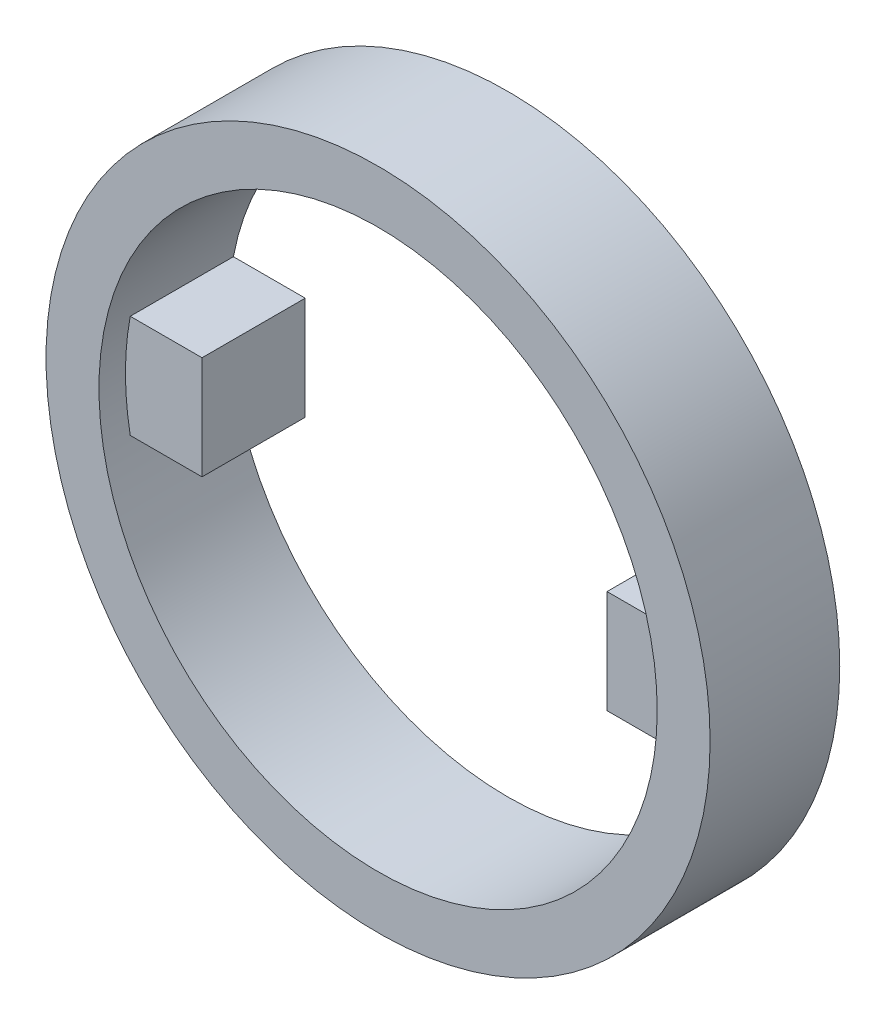
ISO-10303-21;
HEADER;
FILE_DESCRIPTION(('STEP AP214'),'2;1');
FILE_NAME('part.step','',(''),(''),'','','');
FILE_SCHEMA(('AUTOMOTIVE_DESIGN { 1 0 10303 214 1 1 1 1 }'));
ENDSEC;
DATA;
#1=APPLICATION_CONTEXT('core data for automotive mechanical design processes');
#2=APPLICATION_PROTOCOL_DEFINITION('international standard','automotive_design',2000,#1);
#3=PRODUCT_CONTEXT('',#1,'mechanical');
#4=PRODUCT('Part','Part','',(#3));
#5=PRODUCT_RELATED_PRODUCT_CATEGORY('part','',(#4));
#6=PRODUCT_DEFINITION_FORMATION('','',#4);
#7=PRODUCT_DEFINITION_CONTEXT('part definition',#1,'design');
#8=PRODUCT_DEFINITION('design','',#6,#7);
#9=PRODUCT_DEFINITION_SHAPE('','',#8);
#10=(LENGTH_UNIT() NAMED_UNIT(*) SI_UNIT(.MILLI.,.METRE.));
#11=(NAMED_UNIT(*) PLANE_ANGLE_UNIT() SI_UNIT($,.RADIAN.));
#12=(NAMED_UNIT(*) SI_UNIT($,.STERADIAN.) SOLID_ANGLE_UNIT());
#13=UNCERTAINTY_MEASURE_WITH_UNIT(LENGTH_MEASURE(1.E-05),#10,'distance_accuracy_value','');
#14=(GEOMETRIC_REPRESENTATION_CONTEXT(3) GLOBAL_UNCERTAINTY_ASSIGNED_CONTEXT((#13)) GLOBAL_UNIT_ASSIGNED_CONTEXT((#10,
#11,#12)) REPRESENTATION_CONTEXT('',''));
#15=CARTESIAN_POINT('',(0.,0.,0.));
#16=DIRECTION('',(0.,0.,1.));
#17=DIRECTION('',(1.,0.,0.));
#18=AXIS2_PLACEMENT_3D('',#15,#16,#17);
#19=CARTESIAN_POINT('',(0.,0.,4.9));
#20=DIRECTION('',(0.,0.,-1.));
#21=DIRECTION('',(-1.,0.,0.));
#22=AXIS2_PLACEMENT_3D('',#19,#20,#21);
#23=CYLINDRICAL_SURFACE('',#22,10.55);
#24=CARTESIAN_POINT('',(0.,0.,4.9));
#25=DIRECTION('',(0.,0.,1.));
#26=DIRECTION('',(1.,0.,0.));
#27=AXIS2_PLACEMENT_3D('',#24,#25,#26);
#28=CIRCLE('',#27,10.55);
#29=CARTESIAN_POINT('',(10.55,0.,4.9));
#30=VERTEX_POINT('',#29);
#31=EDGE_CURVE('E169',#30,#30,#28,.T.);
#32=ORIENTED_EDGE('',*,*,#31,.T.);
#33=EDGE_LOOP('',(#32));
#34=FACE_BOUND('',#33,.T.);
#35=CARTESIAN_POINT('',(0.,0.,0.));
#36=DIRECTION('',(0.,0.,1.));
#37=DIRECTION('',(1.,0.,0.));
#38=AXIS2_PLACEMENT_3D('',#35,#36,#37);
#39=CIRCLE('',#38,10.55);
#40=CARTESIAN_POINT('',(10.3682206766639,1.95,0.));
#41=VERTEX_POINT('',#40);
#42=CARTESIAN_POINT('',(-10.3682206766639,1.95,0.));
#43=VERTEX_POINT('',#42);
#44=EDGE_CURVE('E168',#41,#43,#39,.T.);
#45=ORIENTED_EDGE('',*,*,#44,.F.);
#46=DIRECTION('',(0.,0.,-1.));
#47=VECTOR('',#46,1.);
#48=CARTESIAN_POINT('',(10.3682206766639,1.95,4.9));
#49=LINE('',#48,#47);
#50=CARTESIAN_POINT('',(10.3682206766639,1.95,3.9));
#51=VERTEX_POINT('',#50);
#52=EDGE_CURVE('E144',#41,#51,#49,.F.);
#53=ORIENTED_EDGE('',*,*,#52,.T.);
#54=CARTESIAN_POINT('',(0.,0.,3.9));
#55=DIRECTION('',(0.,0.,-1.));
#56=DIRECTION('',(-1.,0.,0.));
#57=AXIS2_PLACEMENT_3D('',#54,#55,#56);
#58=CIRCLE('',#57,10.55);
#59=CARTESIAN_POINT('',(10.3682206766639,-1.95,3.9));
#60=VERTEX_POINT('',#59);
#61=EDGE_CURVE('E12',#51,#60,#58,.T.);
#62=ORIENTED_EDGE('',*,*,#61,.T.);
#63=DIRECTION('',(0.,0.,-1.));
#64=VECTOR('',#63,1.);
#65=CARTESIAN_POINT('',(10.3682206766639,-1.95,4.9));
#66=LINE('',#65,#64);
#67=CARTESIAN_POINT('',(10.3682206766639,-1.95,0.));
#68=VERTEX_POINT('',#67);
#69=EDGE_CURVE('E140',#60,#68,#66,.T.);
#70=ORIENTED_EDGE('',*,*,#69,.T.);
#71=CARTESIAN_POINT('',(-10.3682206766639,-1.95,0.));
#72=VERTEX_POINT('',#71);
#73=EDGE_CURVE('E132',#72,#68,#39,.T.);
#74=ORIENTED_EDGE('',*,*,#73,.F.);
#75=DIRECTION('',(0.,0.,-1.));
#76=VECTOR('',#75,1.);
#77=CARTESIAN_POINT('',(-10.3682206766639,-1.95,4.9));
#78=LINE('',#77,#76);
#79=CARTESIAN_POINT('',(-10.3682206766639,-1.95,3.9));
#80=VERTEX_POINT('',#79);
#81=EDGE_CURVE('E181',#72,#80,#78,.F.);
#82=ORIENTED_EDGE('',*,*,#81,.T.);
#83=CARTESIAN_POINT('',(0.,0.,3.9));
#84=DIRECTION('',(0.,0.,1.));
#85=DIRECTION('',(1.,0.,0.));
#86=AXIS2_PLACEMENT_3D('',#83,#84,#85);
#87=CIRCLE('',#86,10.55);
#88=CARTESIAN_POINT('',(-10.3682206766639,1.95,3.9));
#89=VERTEX_POINT('',#88);
#90=EDGE_CURVE('E177',#89,#80,#87,.T.);
#91=ORIENTED_EDGE('',*,*,#90,.F.);
#92=DIRECTION('',(0.,0.,-1.));
#93=VECTOR('',#92,1.);
#94=CARTESIAN_POINT('',(-10.3682206766639,1.95,4.9));
#95=LINE('',#94,#93);
#96=EDGE_CURVE('E55',#89,#43,#95,.T.);
#97=ORIENTED_EDGE('',*,*,#96,.T.);
#98=EDGE_LOOP('',(#45,#53,#62,#70,#74,#82,#91,#97));
#99=FACE_BOUND('',#98,.T.);
#100=ADVANCED_FACE('F47',(#34,#99),#23,.F.);
#101=CARTESIAN_POINT('',(0.,0.,4.9));
#102=DIRECTION('',(0.,0.,1.));
#103=DIRECTION('',(1.,0.,0.));
#104=AXIS2_PLACEMENT_3D('',#101,#102,#103);
#105=PLANE('',#104);
#106=CARTESIAN_POINT('',(0.,0.,4.9));
#107=DIRECTION('',(0.,0.,1.));
#108=DIRECTION('',(1.,0.,0.));
#109=AXIS2_PLACEMENT_3D('',#106,#107,#108);
#110=CIRCLE('',#109,12.55);
#111=CARTESIAN_POINT('',(12.55,0.,4.9));
#112=VERTEX_POINT('',#111);
#113=EDGE_CURVE('E174',#112,#112,#110,.T.);
#114=ORIENTED_EDGE('',*,*,#113,.T.);
#115=EDGE_LOOP('',(#114));
#116=FACE_BOUND('',#115,.T.);
#117=ORIENTED_EDGE('',*,*,#31,.F.);
#118=EDGE_LOOP('',(#117));
#119=FACE_BOUND('',#118,.T.);
#120=ADVANCED_FACE('F213',(#116,#119),#105,.T.);
#121=CARTESIAN_POINT('',(0.,0.,0.));
#122=DIRECTION('',(0.,0.,1.));
#123=DIRECTION('',(1.,0.,0.));
#124=AXIS2_PLACEMENT_3D('',#121,#122,#123);
#125=PLANE('',#124);
#126=ORIENTED_EDGE('',*,*,#73,.T.);
#127=DIRECTION('',(1.,0.,0.));
#128=VECTOR('',#127,1.);
#129=CARTESIAN_POINT('',(11.209871346078,-1.95,0.));
#130=LINE('',#129,#128);
#131=CARTESIAN_POINT('',(7.65419850849141,-1.95,0.));
#132=VERTEX_POINT('',#131);
#133=EDGE_CURVE('E121',#132,#68,#130,.T.);
#134=ORIENTED_EDGE('',*,*,#133,.F.);
#135=DIRECTION('',(0.,-1.,0.));
#136=VECTOR('',#135,1.);
#137=CARTESIAN_POINT('',(7.65419850849141,1.95,0.));
#138=LINE('',#137,#136);
#139=CARTESIAN_POINT('',(7.65419850849141,1.95,0.));
#140=VERTEX_POINT('',#139);
#141=EDGE_CURVE('E112',#140,#132,#138,.T.);
#142=ORIENTED_EDGE('',*,*,#141,.F.);
#143=DIRECTION('',(-1.,0.,0.));
#144=VECTOR('',#143,1.);
#145=CARTESIAN_POINT('',(11.209871346078,1.95,0.));
#146=LINE('',#145,#144);
#147=EDGE_CURVE('E62',#41,#140,#146,.T.);
#148=ORIENTED_EDGE('',*,*,#147,.F.);
#149=ORIENTED_EDGE('',*,*,#44,.T.);
#150=DIRECTION('',(-1.,0.,0.));
#151=VECTOR('',#150,1.);
#152=CARTESIAN_POINT('',(-11.209871346078,1.95,0.));
#153=LINE('',#152,#151);
#154=CARTESIAN_POINT('',(-7.65419850849141,1.95,0.));
#155=VERTEX_POINT('',#154);
#156=EDGE_CURVE('E159',#155,#43,#153,.T.);
#157=ORIENTED_EDGE('',*,*,#156,.F.);
#158=DIRECTION('',(0.,1.,0.));
#159=VECTOR('',#158,1.);
#160=CARTESIAN_POINT('',(-7.65419850849141,1.95,0.));
#161=LINE('',#160,#159);
#162=CARTESIAN_POINT('',(-7.65419850849141,-1.95,0.));
#163=VERTEX_POINT('',#162);
#164=EDGE_CURVE('E147',#163,#155,#161,.T.);
#165=ORIENTED_EDGE('',*,*,#164,.F.);
#166=DIRECTION('',(1.,0.,0.));
#167=VECTOR('',#166,1.);
#168=CARTESIAN_POINT('',(-11.209871346078,-1.95,0.));
#169=LINE('',#168,#167);
#170=EDGE_CURVE('E69',#72,#163,#169,.T.);
#171=ORIENTED_EDGE('',*,*,#170,.F.);
#172=EDGE_LOOP('',(#126,#134,#142,#148,#149,#157,#165,#171));
#173=FACE_BOUND('',#172,.T.);
#174=CARTESIAN_POINT('',(0.,0.,0.));
#175=DIRECTION('',(0.,0.,1.));
#176=DIRECTION('',(1.,0.,0.));
#177=AXIS2_PLACEMENT_3D('',#174,#175,#176);
#178=CIRCLE('',#177,12.55);
#179=CARTESIAN_POINT('',(12.55,0.,0.));
#180=VERTEX_POINT('',#179);
#181=EDGE_CURVE('E172',#180,#180,#178,.T.);
#182=ORIENTED_EDGE('',*,*,#181,.F.);
#183=EDGE_LOOP('',(#182));
#184=FACE_BOUND('',#183,.T.);
#185=ADVANCED_FACE('F129',(#173,#184),#125,.F.);
#186=CARTESIAN_POINT('',(0.,0.,4.9));
#187=DIRECTION('',(0.,0.,-1.));
#188=DIRECTION('',(-1.,0.,0.));
#189=AXIS2_PLACEMENT_3D('',#186,#187,#188);
#190=CYLINDRICAL_SURFACE('',#189,12.55);
#191=ORIENTED_EDGE('',*,*,#113,.F.);
#192=EDGE_LOOP('',(#191));
#193=FACE_BOUND('',#192,.T.);
#194=ORIENTED_EDGE('',*,*,#181,.T.);
#195=EDGE_LOOP('',(#194));
#196=FACE_BOUND('',#195,.T.);
#197=ADVANCED_FACE('F49',(#193,#196),#190,.T.);
#198=CARTESIAN_POINT('',(0.,0.,3.9));
#199=DIRECTION('',(0.,0.,1.));
#200=DIRECTION('',(1.,0.,0.));
#201=AXIS2_PLACEMENT_3D('',#198,#199,#200);
#202=PLANE('',#201);
#203=DIRECTION('',(-1.,0.,0.));
#204=VECTOR('',#203,1.);
#205=CARTESIAN_POINT('',(-11.209871346078,1.95,3.9));
#206=LINE('',#205,#204);
#207=CARTESIAN_POINT('',(-7.65419850849141,1.95,3.9));
#208=VERTEX_POINT('',#207);
#209=EDGE_CURVE('E151',#208,#89,#206,.T.);
#210=ORIENTED_EDGE('',*,*,#209,.T.);
#211=ORIENTED_EDGE('',*,*,#90,.T.);
#212=DIRECTION('',(1.,0.,0.));
#213=VECTOR('',#212,1.);
#214=CARTESIAN_POINT('',(-11.209871346078,-1.95,3.9));
#215=LINE('',#214,#213);
#216=CARTESIAN_POINT('',(-7.65419850849141,-1.95,3.9));
#217=VERTEX_POINT('',#216);
#218=EDGE_CURVE('E154',#80,#217,#215,.T.);
#219=ORIENTED_EDGE('',*,*,#218,.T.);
#220=DIRECTION('',(0.,1.,0.));
#221=VECTOR('',#220,1.);
#222=CARTESIAN_POINT('',(-7.65419850849141,1.95,3.9));
#223=LINE('',#222,#221);
#224=EDGE_CURVE('E148',#217,#208,#223,.T.);
#225=ORIENTED_EDGE('',*,*,#224,.T.);
#226=EDGE_LOOP('',(#210,#211,#219,#225));
#227=FACE_BOUND('',#226,.T.);
#228=ADVANCED_FACE('F190',(#227),#202,.T.);
#229=CARTESIAN_POINT('',(-7.65419850849141,1.95,3.9));
#230=DIRECTION('',(-1.,0.,0.));
#231=DIRECTION('',(0.,0.,1.));
#232=AXIS2_PLACEMENT_3D('',#229,#230,#231);
#233=PLANE('',#232);
#234=ORIENTED_EDGE('',*,*,#164,.T.);
#235=DIRECTION('',(0.,0.,-1.));
#236=VECTOR('',#235,1.);
#237=CARTESIAN_POINT('',(-7.65419850849141,1.95,3.9));
#238=LINE('',#237,#236);
#239=EDGE_CURVE('E165',#208,#155,#238,.T.);
#240=ORIENTED_EDGE('',*,*,#239,.F.);
#241=ORIENTED_EDGE('',*,*,#224,.F.);
#242=DIRECTION('',(0.,0.,-1.));
#243=VECTOR('',#242,1.);
#244=CARTESIAN_POINT('',(-7.65419850849141,-1.95,3.9));
#245=LINE('',#244,#243);
#246=EDGE_CURVE('E156',#217,#163,#245,.T.);
#247=ORIENTED_EDGE('',*,*,#246,.T.);
#248=EDGE_LOOP('',(#234,#240,#241,#247));
#249=FACE_BOUND('',#248,.T.);
#250=ADVANCED_FACE('F196',(#249),#233,.F.);
#251=CARTESIAN_POINT('',(-11.209871346078,1.95,3.9));
#252=DIRECTION('',(0.,-1.,0.));
#253=DIRECTION('',(0.,0.,-1.));
#254=AXIS2_PLACEMENT_3D('',#251,#252,#253);
#255=PLANE('',#254);
#256=ORIENTED_EDGE('',*,*,#96,.F.);
#257=ORIENTED_EDGE('',*,*,#209,.F.);
#258=ORIENTED_EDGE('',*,*,#239,.T.);
#259=ORIENTED_EDGE('',*,*,#156,.T.);
#260=EDGE_LOOP('',(#256,#257,#258,#259));
#261=FACE_BOUND('',#260,.T.);
#262=ADVANCED_FACE('F188',(#261),#255,.F.);
#263=CARTESIAN_POINT('',(-11.209871346078,-1.95,3.9));
#264=DIRECTION('',(0.,1.,0.));
#265=DIRECTION('',(0.,0.,1.));
#266=AXIS2_PLACEMENT_3D('',#263,#264,#265);
#267=PLANE('',#266);
#268=ORIENTED_EDGE('',*,*,#81,.F.);
#269=ORIENTED_EDGE('',*,*,#170,.T.);
#270=ORIENTED_EDGE('',*,*,#246,.F.);
#271=ORIENTED_EDGE('',*,*,#218,.F.);
#272=EDGE_LOOP('',(#268,#269,#270,#271));
#273=FACE_BOUND('',#272,.T.);
#274=ADVANCED_FACE('F198',(#273),#267,.F.);
#275=CARTESIAN_POINT('',(0.,0.,3.9));
#276=DIRECTION('',(0.,0.,-1.));
#277=DIRECTION('',(-1.,0.,0.));
#278=AXIS2_PLACEMENT_3D('',#275,#276,#277);
#279=PLANE('',#278);
#280=ORIENTED_EDGE('',*,*,#61,.F.);
#281=DIRECTION('',(-1.,0.,0.));
#282=VECTOR('',#281,1.);
#283=CARTESIAN_POINT('',(11.209871346078,1.95,3.9));
#284=LINE('',#283,#282);
#285=CARTESIAN_POINT('',(7.65419850849141,1.95,3.9));
#286=VERTEX_POINT('',#285);
#287=EDGE_CURVE('E133',#51,#286,#284,.T.);
#288=ORIENTED_EDGE('',*,*,#287,.T.);
#289=DIRECTION('',(0.,-1.,0.));
#290=VECTOR('',#289,1.);
#291=CARTESIAN_POINT('',(7.65419850849141,1.95,3.9));
#292=LINE('',#291,#290);
#293=CARTESIAN_POINT('',(7.65419850849141,-1.95,3.9));
#294=VERTEX_POINT('',#293);
#295=EDGE_CURVE('E135',#286,#294,#292,.T.);
#296=ORIENTED_EDGE('',*,*,#295,.T.);
#297=DIRECTION('',(1.,0.,0.));
#298=VECTOR('',#297,1.);
#299=CARTESIAN_POINT('',(11.209871346078,-1.95,3.9));
#300=LINE('',#299,#298);
#301=EDGE_CURVE('E127',#294,#60,#300,.T.);
#302=ORIENTED_EDGE('',*,*,#301,.T.);
#303=EDGE_LOOP('',(#280,#288,#296,#302));
#304=FACE_BOUND('',#303,.T.);
#305=ADVANCED_FACE('F200',(#304),#279,.F.);
#306=CARTESIAN_POINT('',(11.209871346078,1.95,3.9));
#307=DIRECTION('',(0.,-1.,0.));
#308=DIRECTION('',(0.,0.,-1.));
#309=AXIS2_PLACEMENT_3D('',#306,#307,#308);
#310=PLANE('',#309);
#311=ORIENTED_EDGE('',*,*,#52,.F.);
#312=ORIENTED_EDGE('',*,*,#147,.T.);
#313=DIRECTION('',(0.,0.,-1.));
#314=VECTOR('',#313,1.);
#315=CARTESIAN_POINT('',(7.65419850849141,1.95,3.9));
#316=LINE('',#315,#314);
#317=EDGE_CURVE('E119',#286,#140,#316,.T.);
#318=ORIENTED_EDGE('',*,*,#317,.F.);
#319=ORIENTED_EDGE('',*,*,#287,.F.);
#320=EDGE_LOOP('',(#311,#312,#318,#319));
#321=FACE_BOUND('',#320,.T.);
#322=ADVANCED_FACE('F203',(#321),#310,.F.);
#323=CARTESIAN_POINT('',(7.65419850849141,1.95,3.9));
#324=DIRECTION('',(1.,0.,0.));
#325=DIRECTION('',(0.,0.,-1.));
#326=AXIS2_PLACEMENT_3D('',#323,#324,#325);
#327=PLANE('',#326);
#328=ORIENTED_EDGE('',*,*,#141,.T.);
#329=DIRECTION('',(0.,0.,-1.));
#330=VECTOR('',#329,1.);
#331=CARTESIAN_POINT('',(7.65419850849141,-1.95,3.9));
#332=LINE('',#331,#330);
#333=EDGE_CURVE('E116',#294,#132,#332,.T.);
#334=ORIENTED_EDGE('',*,*,#333,.F.);
#335=ORIENTED_EDGE('',*,*,#295,.F.);
#336=ORIENTED_EDGE('',*,*,#317,.T.);
#337=EDGE_LOOP('',(#328,#334,#335,#336));
#338=FACE_BOUND('',#337,.T.);
#339=ADVANCED_FACE('F114',(#338),#327,.F.);
#340=CARTESIAN_POINT('',(11.209871346078,-1.95,3.9));
#341=DIRECTION('',(0.,1.,0.));
#342=DIRECTION('',(0.,0.,1.));
#343=AXIS2_PLACEMENT_3D('',#340,#341,#342);
#344=PLANE('',#343);
#345=ORIENTED_EDGE('',*,*,#69,.F.);
#346=ORIENTED_EDGE('',*,*,#301,.F.);
#347=ORIENTED_EDGE('',*,*,#333,.T.);
#348=ORIENTED_EDGE('',*,*,#133,.T.);
#349=EDGE_LOOP('',(#345,#346,#347,#348));
#350=FACE_BOUND('',#349,.T.);
#351=ADVANCED_FACE('F124',(#350),#344,.F.);
#352=CLOSED_SHELL('',(#100,#120,#185,#197,#228,#250,#262,#274,#305,#322,#339,#351));
#353=MANIFOLD_SOLID_BREP('B2',#352);
#354=ADVANCED_BREP_SHAPE_REPRESENTATION('',(#18,#353),#14);
#355=SHAPE_DEFINITION_REPRESENTATION(#9,#354);
ENDSEC;
END-ISO-10303-21;
